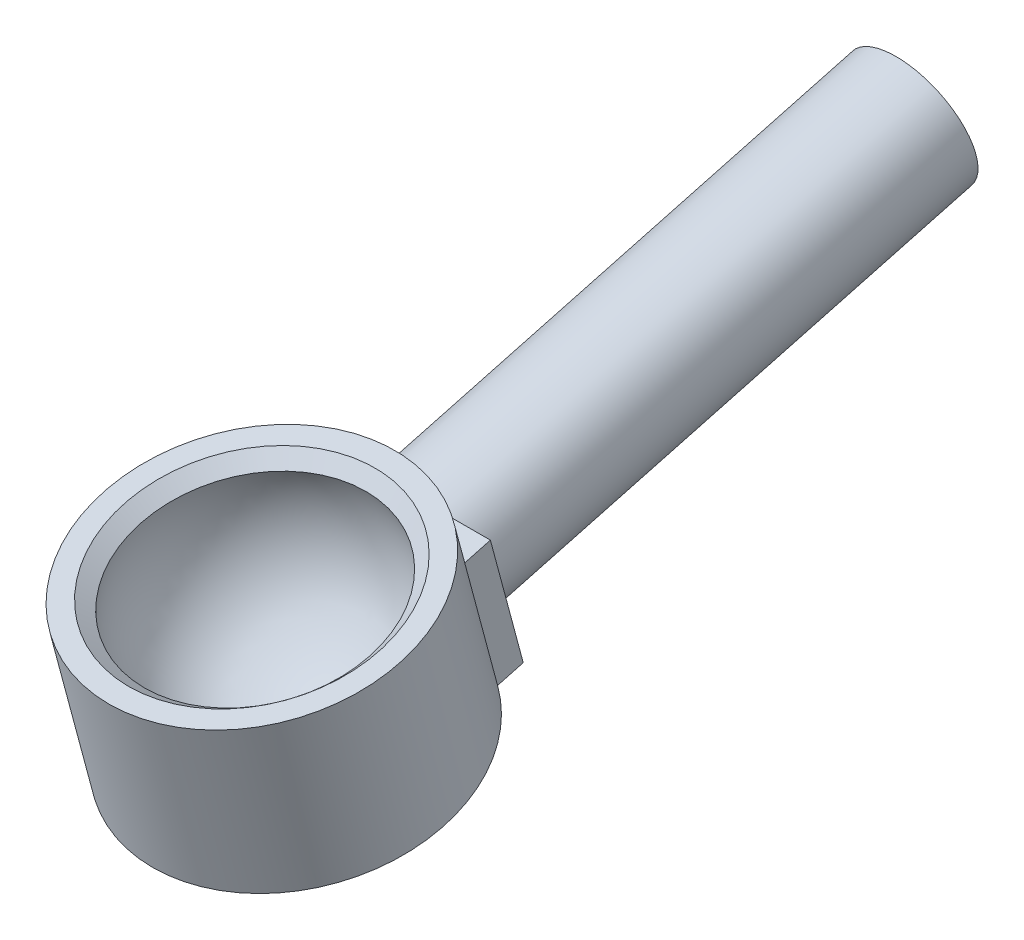
ISO-10303-21;
HEADER;
FILE_DESCRIPTION(('STEP AP214'),'2;1');
FILE_NAME('part.step','',(''),(''),'','','');
FILE_SCHEMA(('AUTOMOTIVE_DESIGN { 1 0 10303 214 1 1 1 1 }'));
ENDSEC;
DATA;
#1=APPLICATION_CONTEXT('core data for automotive mechanical design processes');
#2=APPLICATION_PROTOCOL_DEFINITION('international standard','automotive_design',2000,#1);
#3=PRODUCT_CONTEXT('',#1,'mechanical');
#4=PRODUCT('Part','Part','',(#3));
#5=PRODUCT_RELATED_PRODUCT_CATEGORY('part','',(#4));
#6=PRODUCT_DEFINITION_FORMATION('','',#4);
#7=PRODUCT_DEFINITION_CONTEXT('part definition',#1,'design');
#8=PRODUCT_DEFINITION('design','',#6,#7);
#9=PRODUCT_DEFINITION_SHAPE('','',#8);
#10=(LENGTH_UNIT() NAMED_UNIT(*) SI_UNIT(.MILLI.,.METRE.));
#11=(NAMED_UNIT(*) PLANE_ANGLE_UNIT() SI_UNIT($,.RADIAN.));
#12=(NAMED_UNIT(*) SI_UNIT($,.STERADIAN.) SOLID_ANGLE_UNIT());
#13=UNCERTAINTY_MEASURE_WITH_UNIT(LENGTH_MEASURE(1.E-05),#10,'distance_accuracy_value','');
#14=(GEOMETRIC_REPRESENTATION_CONTEXT(3) GLOBAL_UNCERTAINTY_ASSIGNED_CONTEXT((#13)) GLOBAL_UNIT_ASSIGNED_CONTEXT((#10,
#11,#12)) REPRESENTATION_CONTEXT('',''));
#15=CARTESIAN_POINT('',(0.,0.,0.));
#16=DIRECTION('',(0.,0.,1.));
#17=DIRECTION('',(1.,0.,0.));
#18=AXIS2_PLACEMENT_3D('',#15,#16,#17);
#19=CARTESIAN_POINT('',(193.315035691886,-309.261272903071,586.746396562582));
#20=DIRECTION('',(0.,-0.965925826289069,-0.25881904510252));
#21=DIRECTION('',(0.,0.25881904510252,-0.965925826289069));
#22=AXIS2_PLACEMENT_3D('',#19,#20,#21);
#23=PLANE('',#22);
#24=DIRECTION('',(-1.,0.,0.));
#25=VECTOR('',#24,1.);
#26=CARTESIAN_POINT('',(193.315035691886,-301.496701549996,557.76862177391));
#27=LINE('',#26,#25);
#28=CARTESIAN_POINT('',(193.315035691886,-301.496701549996,557.76862177391));
#29=VERTEX_POINT('',#28);
#30=CARTESIAN_POINT('',(183.315035691886,-301.496701549996,557.76862177391));
#31=VERTEX_POINT('',#30);
#32=EDGE_CURVE('E121',#29,#31,#27,.T.);
#33=ORIENTED_EDGE('',*,*,#32,.T.);
#34=CARTESIAN_POINT('',(183.315035691886,-306.02603483929,574.672323733968));
#35=DIRECTION('',(0.,-0.965925826289069,-0.25881904510252));
#36=DIRECTION('',(0.,0.25881904510252,-0.965925826289069));
#37=AXIS2_PLACEMENT_3D('',#34,#35,#36);
#38=CIRCLE('',#37,17.5);
#39=CARTESIAN_POINT('',(193.315035691886,-302.309029292518,560.800270181402));
#40=VERTEX_POINT('',#39);
#41=EDGE_CURVE('E135',#31,#40,#38,.T.);
#42=ORIENTED_EDGE('',*,*,#41,.T.);
#43=DIRECTION('',(0.,0.25881904510252,-0.965925826289069));
#44=VECTOR('',#43,1.);
#45=CARTESIAN_POINT('',(193.315035691886,-309.261272903071,586.746396562582));
#46=LINE('',#45,#44);
#47=EDGE_CURVE('E125',#40,#29,#46,.T.);
#48=ORIENTED_EDGE('',*,*,#47,.T.);
#49=EDGE_LOOP('',(#33,#42,#48));
#50=FACE_BOUND('',#49,.T.);
#51=ADVANCED_FACE('F40',(#50),#23,.F.);
#52=CARTESIAN_POINT('',(183.315035691886,-293.212002541012,497.871929358297));
#53=DIRECTION('',(0.,-0.25881904510252,0.965925826289069));
#54=DIRECTION('',(0.,-0.965925826289069,-0.25881904510252));
#55=AXIS2_PLACEMENT_3D('',#52,#53,#54);
#56=CYLINDRICAL_SURFACE('',#55,7.50000000000003);
#57=CARTESIAN_POINT('',(183.315035691886,-293.212002541012,497.871929358297));
#58=DIRECTION('',(0.,-0.25881904510252,0.965925826289069));
#59=DIRECTION('',(0.,-0.965925826289069,-0.25881904510252));
#60=AXIS2_PLACEMENT_3D('',#57,#58,#59);
#61=CIRCLE('',#60,7.50000000000003);
#62=CARTESIAN_POINT('',(183.315035691886,-300.45644623818,495.930786520028));
#63=VERTEX_POINT('',#62);
#64=EDGE_CURVE('E131',#63,#63,#61,.T.);
#65=ORIENTED_EDGE('',*,*,#64,.T.);
#66=EDGE_LOOP('',(#65));
#67=FACE_BOUND('',#66,.T.);
#68=CARTESIAN_POINT('',(183.315035691886,-308.741145247164,555.827478935641));
#69=DIRECTION('',(0.,-0.25881904510252,0.965925826289069));
#70=DIRECTION('',(0.,-0.965925826289069,-0.25881904510252));
#71=AXIS2_PLACEMENT_3D('',#68,#69,#70);
#72=CIRCLE('',#71,7.50000000000003);
#73=CARTESIAN_POINT('',(183.315035691886,-315.985588944332,553.886336097372));
#74=VERTEX_POINT('',#73);
#75=EDGE_CURVE('E128',#74,#31,#72,.T.);
#76=ORIENTED_EDGE('',*,*,#75,.F.);
#77=EDGE_CURVE('E95',#31,#74,#72,.T.);
#78=ORIENTED_EDGE('',*,*,#77,.F.);
#79=EDGE_LOOP('',(#76,#78));
#80=FACE_BOUND('',#79,.T.);
#81=ADVANCED_FACE('F170',(#67,#80),#56,.T.);
#82=CARTESIAN_POINT('',(183.315035691886,-293.212002541012,497.871929358297));
#83=DIRECTION('',(0.,-0.25881904510252,0.965925826289069));
#84=DIRECTION('',(0.,-0.965925826289069,-0.25881904510252));
#85=AXIS2_PLACEMENT_3D('',#82,#83,#84);
#86=PLANE('',#85);
#87=ORIENTED_EDGE('',*,*,#64,.F.);
#88=EDGE_LOOP('',(#87));
#89=FACE_BOUND('',#88,.T.);
#90=ADVANCED_FACE('F175',(#89),#86,.F.);
#91=CARTESIAN_POINT('',(-3.30723994978728E-12,-159.638604868715,595.779384219473));
#92=DIRECTION('',(0.,-0.258819045102514,0.96592582628907));
#93=DIRECTION('',(0.,-0.96592582628907,-0.258819045102514));
#94=AXIS2_PLACEMENT_3D('',#91,#92,#93);
#95=PLANE('',#94);
#96=DIRECTION('',(1.,0.,0.));
#97=VECTOR('',#96,1.);
#98=CARTESIAN_POINT('',(193.315035691886,-315.985588944332,553.886336097372));
#99=LINE('',#98,#97);
#100=CARTESIAN_POINT('',(193.315035691886,-315.985588944332,553.886336097372));
#101=VERTEX_POINT('',#100);
#102=EDGE_CURVE('E107',#74,#101,#99,.T.);
#103=ORIENTED_EDGE('',*,*,#102,.F.);
#104=ORIENTED_EDGE('',*,*,#75,.T.);
#105=ORIENTED_EDGE('',*,*,#32,.F.);
#106=DIRECTION('',(0.,0.965925826289068,0.258819045102521));
#107=VECTOR('',#106,1.);
#108=CARTESIAN_POINT('',(193.315035691886,-315.985588944332,553.886336097372));
#109=LINE('',#108,#107);
#110=EDGE_CURVE('E106',#101,#29,#109,.T.);
#111=ORIENTED_EDGE('',*,*,#110,.F.);
#112=EDGE_LOOP('',(#103,#104,#105,#111));
#113=FACE_BOUND('',#112,.T.);
#114=ADVANCED_FACE('F178',(#113),#95,.F.);
#115=CARTESIAN_POINT('',(173.315035691886,-301.496701549996,557.76862177391));
#116=VERTEX_POINT('',#115);
#117=EDGE_CURVE('E120',#31,#116,#27,.T.);
#118=ORIENTED_EDGE('',*,*,#117,.F.);
#119=ORIENTED_EDGE('',*,*,#77,.T.);
#120=CARTESIAN_POINT('',(173.315035691886,-315.985588944332,553.886336097372));
#121=VERTEX_POINT('',#120);
#122=EDGE_CURVE('E92',#121,#74,#99,.T.);
#123=ORIENTED_EDGE('',*,*,#122,.F.);
#124=DIRECTION('',(0.,-0.96592582628907,-0.258819045102514));
#125=VECTOR('',#124,1.);
#126=CARTESIAN_POINT('',(173.315035691886,-315.985588944332,553.886336097372));
#127=LINE('',#126,#125);
#128=EDGE_CURVE('E103',#116,#121,#127,.T.);
#129=ORIENTED_EDGE('',*,*,#128,.F.);
#130=EDGE_LOOP('',(#118,#119,#123,#129));
#131=FACE_BOUND('',#130,.T.);
#132=ADVANCED_FACE('F102',(#131),#95,.F.);
#133=CARTESIAN_POINT('',(173.315035691886,-323.750160297407,582.864110886044));
#134=DIRECTION('',(1.,0.,0.));
#135=DIRECTION('',(0.,0.,-1.));
#136=AXIS2_PLACEMENT_3D('',#133,#134,#135);
#137=PLANE('',#136);
#138=DIRECTION('',(0.,0.25881904510252,-0.965925826289069));
#139=VECTOR('',#138,1.);
#140=CARTESIAN_POINT('',(173.315035691886,-323.750160297407,582.864110886044));
#141=LINE('',#140,#139);
#142=CARTESIAN_POINT('',(173.315035691886,-316.797916686854,556.917984504864));
#143=VERTEX_POINT('',#142);
#144=EDGE_CURVE('E56',#143,#121,#141,.T.);
#145=ORIENTED_EDGE('',*,*,#144,.F.);
#146=DIRECTION('',(0.,0.965925826289069,0.25881904510252));
#147=VECTOR('',#146,1.);
#148=CARTESIAN_POINT('',(173.315035691886,-316.797916686854,556.917984504864));
#149=LINE('',#148,#147);
#150=CARTESIAN_POINT('',(173.315035691886,-302.309029292518,560.800270181402));
#151=VERTEX_POINT('',#150);
#152=EDGE_CURVE('E113',#143,#151,#149,.T.);
#153=ORIENTED_EDGE('',*,*,#152,.T.);
#154=DIRECTION('',(0.,0.25881904510252,-0.965925826289069));
#155=VECTOR('',#154,1.);
#156=CARTESIAN_POINT('',(173.315035691886,-309.261272903071,586.746396562582));
#157=LINE('',#156,#155);
#158=EDGE_CURVE('E111',#151,#116,#157,.T.);
#159=ORIENTED_EDGE('',*,*,#158,.T.);
#160=ORIENTED_EDGE('',*,*,#128,.T.);
#161=EDGE_LOOP('',(#145,#153,#159,#160));
#162=FACE_BOUND('',#161,.T.);
#163=ADVANCED_FACE('F109',(#162),#137,.F.);
#164=CARTESIAN_POINT('',(193.315035691886,-323.750160297407,582.864110886044));
#165=DIRECTION('',(0.,0.965925826289069,0.25881904510252));
#166=DIRECTION('',(0.,-0.25881904510252,0.965925826289069));
#167=AXIS2_PLACEMENT_3D('',#164,#165,#166);
#168=PLANE('',#167);
#169=CARTESIAN_POINT('',(183.315035691886,-320.514922233626,570.790038057431));
#170=DIRECTION('',(0.,0.965925826289069,0.25881904510252));
#171=DIRECTION('',(0.,-0.25881904510252,0.965925826289069));
#172=AXIS2_PLACEMENT_3D('',#169,#170,#171);
#173=CIRCLE('',#172,17.5);
#174=CARTESIAN_POINT('',(193.315035691886,-316.797916686854,556.917984504864));
#175=VERTEX_POINT('',#174);
#176=EDGE_CURVE('E94',#143,#175,#173,.T.);
#177=ORIENTED_EDGE('',*,*,#176,.F.);
#178=ORIENTED_EDGE('',*,*,#144,.T.);
#179=ORIENTED_EDGE('',*,*,#122,.T.);
#180=ORIENTED_EDGE('',*,*,#102,.T.);
#181=DIRECTION('',(0.,0.25881904510252,-0.965925826289069));
#182=VECTOR('',#181,1.);
#183=CARTESIAN_POINT('',(193.315035691886,-323.750160297407,582.864110886044));
#184=LINE('',#183,#182);
#185=EDGE_CURVE('E96',#175,#101,#184,.T.);
#186=ORIENTED_EDGE('',*,*,#185,.F.);
#187=EDGE_LOOP('',(#177,#178,#179,#180,#186));
#188=FACE_BOUND('',#187,.T.);
#189=ADVANCED_FACE('F90',(#188),#168,.F.);
#190=CARTESIAN_POINT('',(193.315035691886,-323.750160297407,582.864110886044));
#191=DIRECTION('',(-1.,0.,0.));
#192=DIRECTION('',(0.,0.,1.));
#193=AXIS2_PLACEMENT_3D('',#190,#191,#192);
#194=PLANE('',#193);
#195=ORIENTED_EDGE('',*,*,#47,.F.);
#196=DIRECTION('',(0.,0.965925826289069,0.25881904510252));
#197=VECTOR('',#196,1.);
#198=CARTESIAN_POINT('',(193.315035691886,-316.797916686854,556.917984504864));
#199=LINE('',#198,#197);
#200=EDGE_CURVE('E64',#40,#175,#199,.F.);
#201=ORIENTED_EDGE('',*,*,#200,.T.);
#202=ORIENTED_EDGE('',*,*,#185,.T.);
#203=ORIENTED_EDGE('',*,*,#110,.T.);
#204=EDGE_LOOP('',(#195,#201,#202,#203));
#205=FACE_BOUND('',#204,.T.);
#206=ADVANCED_FACE('F144',(#205),#194,.F.);
#207=ORIENTED_EDGE('',*,*,#158,.F.);
#208=EDGE_CURVE('E134',#151,#31,#38,.T.);
#209=ORIENTED_EDGE('',*,*,#208,.T.);
#210=ORIENTED_EDGE('',*,*,#117,.T.);
#211=EDGE_LOOP('',(#207,#209,#210));
#212=FACE_BOUND('',#211,.T.);
#213=ADVANCED_FACE('F156',(#212),#23,.F.);
#214=CARTESIAN_POINT('',(183.315035691886,-320.514922233626,570.790038057431));
#215=DIRECTION('',(0.,0.965925826289069,0.25881904510252));
#216=DIRECTION('',(0.,-0.25881904510252,0.965925826289069));
#217=AXIS2_PLACEMENT_3D('',#214,#215,#216);
#218=CYLINDRICAL_SURFACE('',#217,17.5);
#219=CARTESIAN_POINT('',(183.315035691886,-301.196405707844,575.966418959481));
#220=DIRECTION('',(0.,0.965925826289069,0.25881904510252));
#221=DIRECTION('',(0.,-0.25881904510252,0.965925826289069));
#222=AXIS2_PLACEMENT_3D('',#219,#220,#221);
#223=CIRCLE('',#222,17.5);
#224=CARTESIAN_POINT('',(183.315035691886,-305.725738997139,592.87012091954));
#225=VERTEX_POINT('',#224);
#226=EDGE_CURVE('E147',#225,#225,#223,.T.);
#227=ORIENTED_EDGE('',*,*,#226,.F.);
#228=EDGE_LOOP('',(#227));
#229=FACE_BOUND('',#228,.T.);
#230=ORIENTED_EDGE('',*,*,#152,.F.);
#231=ORIENTED_EDGE('',*,*,#176,.T.);
#232=ORIENTED_EDGE('',*,*,#200,.F.);
#233=ORIENTED_EDGE('',*,*,#41,.F.);
#234=ORIENTED_EDGE('',*,*,#208,.F.);
#235=EDGE_LOOP('',(#230,#231,#232,#233,#234));
#236=FACE_BOUND('',#235,.T.);
#237=ADVANCED_FACE('F146',(#229,#236),#218,.T.);
#238=CARTESIAN_POINT('',(183.315035691886,-301.196405707844,575.966418959481));
#239=DIRECTION('',(0.,0.965925826289069,0.25881904510252));
#240=DIRECTION('',(0.,-0.25881904510252,0.965925826289069));
#241=AXIS2_PLACEMENT_3D('',#238,#239,#240);
#242=PLANE('',#241);
#243=CARTESIAN_POINT('',(183.315035691886,-301.196405707844,575.966418959481));
#244=DIRECTION('',(0.,0.965925826289069,0.25881904510252));
#245=DIRECTION('',(0.,-0.25881904510252,0.965925826289069));
#246=AXIS2_PLACEMENT_3D('',#243,#244,#245);
#247=CIRCLE('',#246,15.0766968306223);
#248=CARTESIAN_POINT('',(183.315035691886,-305.098541984846,590.52938980331));
#249=VERTEX_POINT('',#248);
#250=EDGE_CURVE('E11',#249,#249,#247,.F.);
#251=ORIENTED_EDGE('',*,*,#250,.T.);
#252=EDGE_LOOP('',(#251));
#253=FACE_BOUND('',#252,.T.);
#254=ORIENTED_EDGE('',*,*,#226,.T.);
#255=EDGE_LOOP('',(#254));
#256=FACE_BOUND('',#255,.T.);
#257=ADVANCED_FACE('F153',(#253,#256),#242,.T.);
#258=CARTESIAN_POINT('',(183.315035691886,-306.02603483929,574.672323733968));
#259=DIRECTION('',(0.,0.25881904510252,-0.965925826289069));
#260=DIRECTION('',(-1.,0.,0.));
#261=AXIS2_PLACEMENT_3D('',#258,#259,#260);
#262=SPHERICAL_SURFACE('',#261,14.);
#263=CARTESIAN_POINT('',(183.315035691886,-306.02603483929,574.672323733968));
#264=DIRECTION('',(0.,-0.965925826289063,-0.258819045102541));
#265=DIRECTION('',(0.,0.258819045102541,-0.965925826289063));
#266=AXIS2_PLACEMENT_3D('',#263,#264,#265);
#267=SPHERICAL_SURFACE('',#266,14.);
#268=CARTESIAN_POINT('',(183.315035691886,-302.661620738871,575.573815775179));
#269=DIRECTION('',(0.,-0.965925826289063,-0.258819045102541));
#270=DIRECTION('',(0.,0.258819045102541,-0.965925826289063));
#271=AXIS2_PLACEMENT_3D('',#268,#269,#270);
#272=CIRCLE('',#271,13.5597946098213);
#273=CARTESIAN_POINT('',(183.315035691886,-299.152087646171,562.476059962378));
#274=VERTEX_POINT('',#273);
#275=EDGE_CURVE('E49',#274,#274,#272,.F.);
#276=ORIENTED_EDGE('',*,*,#275,.T.);
#277=EDGE_LOOP('',(#276));
#278=FACE_BOUND('',#277,.T.);
#279=ADVANCED_FACE('F163',(#278),#267,.F.);
#280=CARTESIAN_POINT('',(183.315035691886,-302.661620738871,575.573815775179));
#281=DIRECTION('',(0.,0.965925826289063,0.258819045102541));
#282=DIRECTION('',(0.,-0.258819045102541,0.965925826289063));
#283=AXIS2_PLACEMENT_3D('',#280,#281,#282);
#284=CONICAL_SURFACE('',#283,13.5597946098213,0.785398163397437);
#285=ORIENTED_EDGE('',*,*,#250,.F.);
#286=EDGE_LOOP('',(#285));
#287=FACE_BOUND('',#286,.T.);
#288=ORIENTED_EDGE('',*,*,#275,.F.);
#289=EDGE_LOOP('',(#288));
#290=FACE_BOUND('',#289,.T.);
#291=ADVANCED_FACE('F43',(#287,#290),#284,.F.);
#292=CLOSED_SHELL('',(#51,#81,#90,#114,#132,#163,#189,#206,#213,#237,#257,#279,#291));
#293=MANIFOLD_SOLID_BREP('B2',#292);
#294=ADVANCED_BREP_SHAPE_REPRESENTATION('',(#18,#293),#14);
#295=SHAPE_DEFINITION_REPRESENTATION(#9,#294);
ENDSEC;
END-ISO-10303-21;
